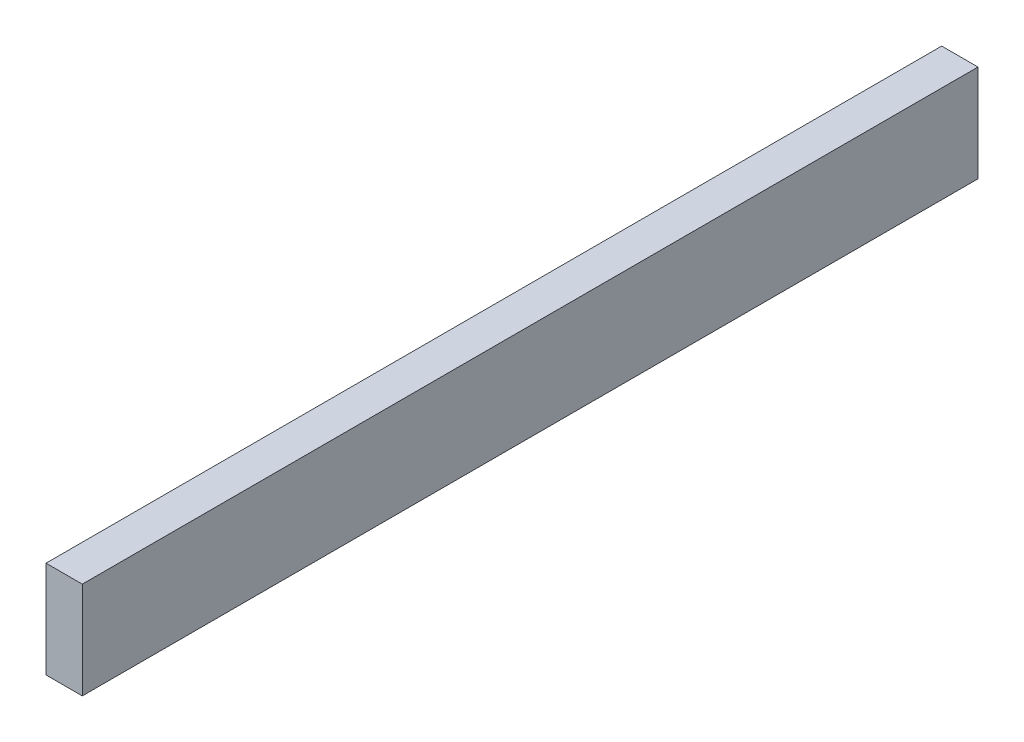
ISO-10303-21;
HEADER;
FILE_DESCRIPTION(('STEP AP214'),'2;1');
FILE_NAME('part.step','',(''),(''),'','','');
FILE_SCHEMA(('AUTOMOTIVE_DESIGN { 1 0 10303 214 1 1 1 1 }'));
ENDSEC;
DATA;
#1=APPLICATION_CONTEXT('core data for automotive mechanical design processes');
#2=APPLICATION_PROTOCOL_DEFINITION('international standard','automotive_design',2000,#1);
#3=PRODUCT_CONTEXT('',#1,'mechanical');
#4=PRODUCT('Part','Part','',(#3));
#5=PRODUCT_RELATED_PRODUCT_CATEGORY('part','',(#4));
#6=PRODUCT_DEFINITION_FORMATION('','',#4);
#7=PRODUCT_DEFINITION_CONTEXT('part definition',#1,'design');
#8=PRODUCT_DEFINITION('design','',#6,#7);
#9=PRODUCT_DEFINITION_SHAPE('','',#8);
#10=(LENGTH_UNIT() NAMED_UNIT(*) SI_UNIT(.MILLI.,.METRE.));
#11=(NAMED_UNIT(*) PLANE_ANGLE_UNIT() SI_UNIT($,.RADIAN.));
#12=(NAMED_UNIT(*) SI_UNIT($,.STERADIAN.) SOLID_ANGLE_UNIT());
#13=UNCERTAINTY_MEASURE_WITH_UNIT(LENGTH_MEASURE(1.E-05),#10,'distance_accuracy_value','');
#14=(GEOMETRIC_REPRESENTATION_CONTEXT(3) GLOBAL_UNCERTAINTY_ASSIGNED_CONTEXT((#13)) GLOBAL_UNIT_ASSIGNED_CONTEXT((#10,
#11,#12)) REPRESENTATION_CONTEXT('',''));
#15=CARTESIAN_POINT('',(0.,0.,0.));
#16=DIRECTION('',(0.,0.,1.));
#17=DIRECTION('',(1.,0.,0.));
#18=AXIS2_PLACEMENT_3D('',#15,#16,#17);
#19=CARTESIAN_POINT('',(-2.425,1.47,-3.7));
#20=DIRECTION('',(0.,1.,0.));
#21=DIRECTION('',(1.,0.,0.));
#22=AXIS2_PLACEMENT_3D('',#19,#20,#21);
#23=PLANE('',#22);
#24=DIRECTION('',(0.,0.,1.));
#25=VECTOR('',#24,1.);
#26=CARTESIAN_POINT('',(-2.425,1.47,-3.7));
#27=LINE('',#26,#25);
#28=CARTESIAN_POINT('',(-2.425,1.47,-3.7));
#29=VERTEX_POINT('',#28);
#30=CARTESIAN_POINT('',(-2.425,1.47,0.));
#31=VERTEX_POINT('',#30);
#32=EDGE_CURVE('E11',#29,#31,#27,.T.);
#33=ORIENTED_EDGE('',*,*,#32,.F.);
#34=DIRECTION('',(-1.,0.,0.));
#35=VECTOR('',#34,1.);
#36=CARTESIAN_POINT('',(-2.425,1.47,-3.7));
#37=LINE('',#36,#35);
#38=CARTESIAN_POINT('',(-2.575,1.47,-3.7));
#39=VERTEX_POINT('',#38);
#40=EDGE_CURVE('E44',#29,#39,#37,.T.);
#41=ORIENTED_EDGE('',*,*,#40,.T.);
#42=DIRECTION('',(0.,0.,1.));
#43=VECTOR('',#42,1.);
#44=CARTESIAN_POINT('',(-2.575,1.47,-3.7));
#45=LINE('',#44,#43);
#46=CARTESIAN_POINT('',(-2.575,1.47,0.));
#47=VERTEX_POINT('',#46);
#48=EDGE_CURVE('E101',#39,#47,#45,.T.);
#49=ORIENTED_EDGE('',*,*,#48,.T.);
#50=DIRECTION('',(1.,0.,0.));
#51=VECTOR('',#50,1.);
#52=CARTESIAN_POINT('',(-2.575,1.47,0.));
#53=LINE('',#52,#51);
#54=EDGE_CURVE('E100',#47,#31,#53,.T.);
#55=ORIENTED_EDGE('',*,*,#54,.T.);
#56=EDGE_LOOP('',(#33,#41,#49,#55));
#57=FACE_BOUND('',#56,.T.);
#58=ADVANCED_FACE('F17',(#57),#23,.T.);
#59=CARTESIAN_POINT('',(-2.425,1.07,-3.7));
#60=DIRECTION('',(1.,0.,0.));
#61=DIRECTION('',(0.,1.,0.));
#62=AXIS2_PLACEMENT_3D('',#59,#60,#61);
#63=PLANE('',#62);
#64=DIRECTION('',(0.,0.,1.));
#65=VECTOR('',#64,1.);
#66=CARTESIAN_POINT('',(-2.425,1.07,-3.7));
#67=LINE('',#66,#65);
#68=CARTESIAN_POINT('',(-2.425,1.07,-3.7));
#69=VERTEX_POINT('',#68);
#70=CARTESIAN_POINT('',(-2.425,1.07,0.));
#71=VERTEX_POINT('',#70);
#72=EDGE_CURVE('E21',#69,#71,#67,.T.);
#73=ORIENTED_EDGE('',*,*,#72,.F.);
#74=DIRECTION('',(0.,1.,0.));
#75=VECTOR('',#74,1.);
#76=CARTESIAN_POINT('',(-2.425,1.07,-3.7));
#77=LINE('',#76,#75);
#78=EDGE_CURVE('E27',#69,#29,#77,.T.);
#79=ORIENTED_EDGE('',*,*,#78,.T.);
#80=ORIENTED_EDGE('',*,*,#32,.T.);
#81=DIRECTION('',(0.,-1.,0.));
#82=VECTOR('',#81,1.);
#83=CARTESIAN_POINT('',(-2.425,1.47,0.));
#84=LINE('',#83,#82);
#85=EDGE_CURVE('E80',#31,#71,#84,.T.);
#86=ORIENTED_EDGE('',*,*,#85,.T.);
#87=EDGE_LOOP('',(#73,#79,#80,#86));
#88=FACE_BOUND('',#87,.T.);
#89=ADVANCED_FACE('F19',(#88),#63,.T.);
#90=CARTESIAN_POINT('',(0.,0.,-3.7));
#91=DIRECTION('',(0.,0.,1.));
#92=DIRECTION('',(1.,0.,0.));
#93=AXIS2_PLACEMENT_3D('',#90,#91,#92);
#94=PLANE('',#93);
#95=DIRECTION('',(0.,-1.,0.));
#96=VECTOR('',#95,1.);
#97=CARTESIAN_POINT('',(-2.575,1.47,-3.7));
#98=LINE('',#97,#96);
#99=CARTESIAN_POINT('',(-2.575,1.07,-3.7));
#100=VERTEX_POINT('',#99);
#101=EDGE_CURVE('E104',#39,#100,#98,.T.);
#102=ORIENTED_EDGE('',*,*,#101,.F.);
#103=ORIENTED_EDGE('',*,*,#40,.F.);
#104=ORIENTED_EDGE('',*,*,#78,.F.);
#105=DIRECTION('',(1.,0.,0.));
#106=VECTOR('',#105,1.);
#107=CARTESIAN_POINT('',(-2.575,1.07,-3.7));
#108=LINE('',#107,#106);
#109=EDGE_CURVE('E73',#100,#69,#108,.T.);
#110=ORIENTED_EDGE('',*,*,#109,.F.);
#111=EDGE_LOOP('',(#102,#103,#104,#110));
#112=FACE_BOUND('',#111,.T.);
#113=ADVANCED_FACE('F71',(#112),#94,.F.);
#114=CARTESIAN_POINT('',(-2.575,1.47,-3.7));
#115=DIRECTION('',(-1.,0.,0.));
#116=DIRECTION('',(0.,0.,1.));
#117=AXIS2_PLACEMENT_3D('',#114,#115,#116);
#118=PLANE('',#117);
#119=ORIENTED_EDGE('',*,*,#48,.F.);
#120=ORIENTED_EDGE('',*,*,#101,.T.);
#121=DIRECTION('',(0.,0.,-1.));
#122=VECTOR('',#121,1.);
#123=CARTESIAN_POINT('',(-2.575,1.07,0.));
#124=LINE('',#123,#122);
#125=CARTESIAN_POINT('',(-2.575,1.07,0.));
#126=VERTEX_POINT('',#125);
#127=EDGE_CURVE('E88',#126,#100,#124,.T.);
#128=ORIENTED_EDGE('',*,*,#127,.F.);
#129=DIRECTION('',(0.,1.,0.));
#130=VECTOR('',#129,1.);
#131=CARTESIAN_POINT('',(-2.575,1.07,0.));
#132=LINE('',#131,#130);
#133=EDGE_CURVE('E105',#126,#47,#132,.T.);
#134=ORIENTED_EDGE('',*,*,#133,.T.);
#135=EDGE_LOOP('',(#119,#120,#128,#134));
#136=FACE_BOUND('',#135,.T.);
#137=ADVANCED_FACE('F121',(#136),#118,.T.);
#138=CARTESIAN_POINT('',(0.,0.,0.));
#139=DIRECTION('',(0.,0.,1.));
#140=DIRECTION('',(1.,0.,0.));
#141=AXIS2_PLACEMENT_3D('',#138,#139,#140);
#142=PLANE('',#141);
#143=ORIENTED_EDGE('',*,*,#85,.F.);
#144=ORIENTED_EDGE('',*,*,#54,.F.);
#145=ORIENTED_EDGE('',*,*,#133,.F.);
#146=DIRECTION('',(-1.,0.,0.));
#147=VECTOR('',#146,1.);
#148=CARTESIAN_POINT('',(-2.425,1.07,0.));
#149=LINE('',#148,#147);
#150=EDGE_CURVE('E85',#71,#126,#149,.T.);
#151=ORIENTED_EDGE('',*,*,#150,.F.);
#152=EDGE_LOOP('',(#143,#144,#145,#151));
#153=FACE_BOUND('',#152,.T.);
#154=ADVANCED_FACE('F120',(#153),#142,.T.);
#155=CARTESIAN_POINT('',(-2.575,1.07,-3.7));
#156=DIRECTION('',(0.,-1.,0.));
#157=DIRECTION('',(0.,0.,-1.));
#158=AXIS2_PLACEMENT_3D('',#155,#156,#157);
#159=PLANE('',#158);
#160=ORIENTED_EDGE('',*,*,#127,.T.);
#161=ORIENTED_EDGE('',*,*,#109,.T.);
#162=ORIENTED_EDGE('',*,*,#72,.T.);
#163=ORIENTED_EDGE('',*,*,#150,.T.);
#164=EDGE_LOOP('',(#160,#161,#162,#163));
#165=FACE_BOUND('',#164,.T.);
#166=ADVANCED_FACE('F86',(#165),#159,.T.);
#167=CLOSED_SHELL('',(#58,#89,#113,#137,#154,#166));
#168=MANIFOLD_SOLID_BREP('B1',#167);
#169=ADVANCED_BREP_SHAPE_REPRESENTATION('',(#18,#168),#14);
#170=SHAPE_DEFINITION_REPRESENTATION(#9,#169);
ENDSEC;
END-ISO-10303-21;
